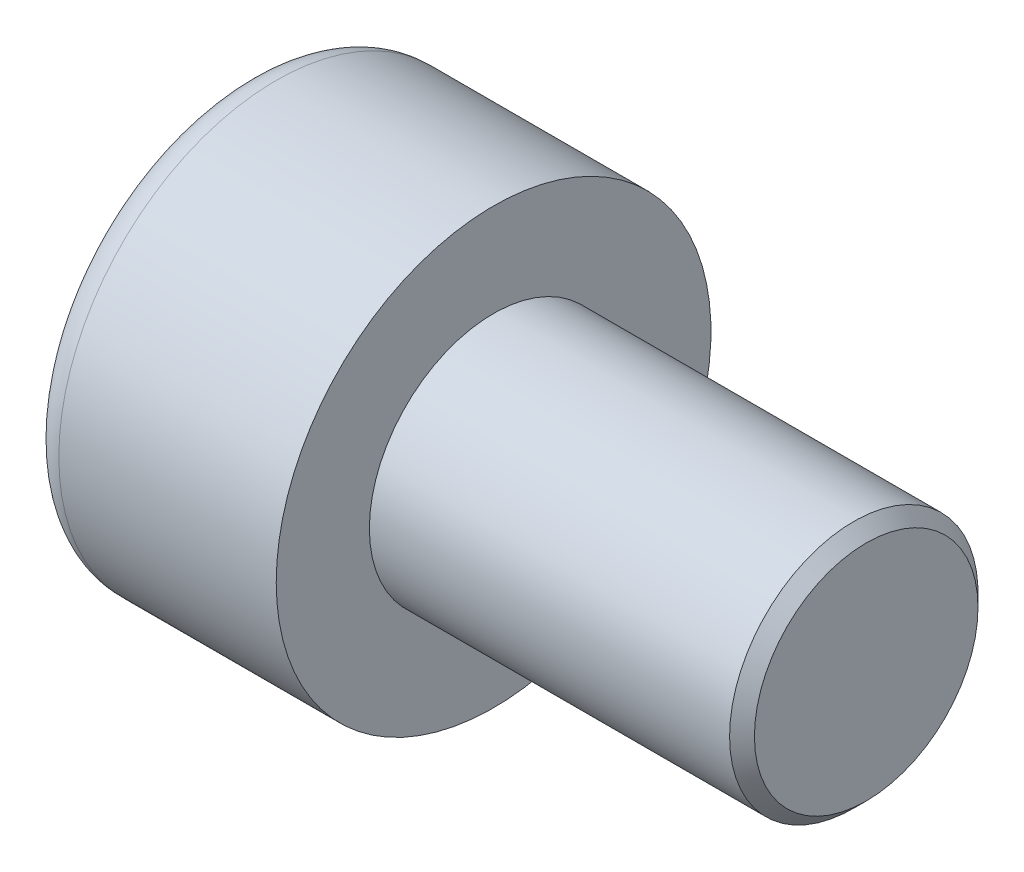
ISO-10303-21;
HEADER;
FILE_DESCRIPTION(('STEP AP214'),'2;1');
FILE_NAME('part.step','',(''),(''),'','','');
FILE_SCHEMA(('AUTOMOTIVE_DESIGN { 1 0 10303 214 1 1 1 1 }'));
ENDSEC;
DATA;
#1=APPLICATION_CONTEXT('core data for automotive mechanical design processes');
#2=APPLICATION_PROTOCOL_DEFINITION('international standard','automotive_design',2000,#1);
#3=PRODUCT_CONTEXT('',#1,'mechanical');
#4=PRODUCT('Part','Part','',(#3));
#5=PRODUCT_RELATED_PRODUCT_CATEGORY('part','',(#4));
#6=PRODUCT_DEFINITION_FORMATION('','',#4);
#7=PRODUCT_DEFINITION_CONTEXT('part definition',#1,'design');
#8=PRODUCT_DEFINITION('design','',#6,#7);
#9=PRODUCT_DEFINITION_SHAPE('','',#8);
#10=(LENGTH_UNIT() NAMED_UNIT(*) SI_UNIT(.MILLI.,.METRE.));
#11=(NAMED_UNIT(*) PLANE_ANGLE_UNIT() SI_UNIT($,.RADIAN.));
#12=(NAMED_UNIT(*) SI_UNIT($,.STERADIAN.) SOLID_ANGLE_UNIT());
#13=UNCERTAINTY_MEASURE_WITH_UNIT(LENGTH_MEASURE(1.E-05),#10,'distance_accuracy_value','');
#14=(GEOMETRIC_REPRESENTATION_CONTEXT(3) GLOBAL_UNCERTAINTY_ASSIGNED_CONTEXT((#13)) GLOBAL_UNIT_ASSIGNED_CONTEXT((#10,
#11,#12)) REPRESENTATION_CONTEXT('',''));
#15=CARTESIAN_POINT('',(0.,0.,0.));
#16=DIRECTION('',(0.,0.,1.));
#17=DIRECTION('',(1.,0.,0.));
#18=AXIS2_PLACEMENT_3D('',#15,#16,#17);
#19=CARTESIAN_POINT('',(2.,0.,-1.73205080756888));
#20=DIRECTION('',(1.,0.,0.));
#21=DIRECTION('',(0.,0.,-1.));
#22=AXIS2_PLACEMENT_3D('',#19,#20,#21);
#23=PLANE('',#22);
#24=DIRECTION('',(0.,0.866025403784439,0.5));
#25=VECTOR('',#24,1.);
#26=CARTESIAN_POINT('',(2.,0.,1.73205080756888));
#27=LINE('',#26,#25);
#28=CARTESIAN_POINT('',(2.,0.,1.73205080756888));
#29=VERTEX_POINT('',#28);
#30=CARTESIAN_POINT('',(2.00000000000477,-0.750000000005344,1.29903810568591));
#31=VERTEX_POINT('',#30);
#32=EDGE_CURVE('E120',#29,#31,#27,.F.);
#33=ORIENTED_EDGE('',*,*,#32,.F.);
#34=DIRECTION('',(0.,0.866025403784439,-0.5));
#35=VECTOR('',#34,1.);
#36=CARTESIAN_POINT('',(2.,1.5,0.866025403784439));
#37=LINE('',#36,#35);
#38=CARTESIAN_POINT('',(2.00000000000477,0.750000000005344,1.29903810568591));
#39=VERTEX_POINT('',#38);
#40=EDGE_CURVE('E119',#39,#29,#37,.F.);
#41=ORIENTED_EDGE('',*,*,#40,.F.);
#42=CARTESIAN_POINT('',(2.00000000000955,0.,0.));
#43=DIRECTION('',(-1.,0.,0.));
#44=DIRECTION('',(0.,0.,1.));
#45=AXIS2_PLACEMENT_3D('',#42,#43,#44);
#46=CIRCLE('',#45,1.50000000002137);
#47=EDGE_CURVE('E94',#39,#31,#46,.F.);
#48=ORIENTED_EDGE('',*,*,#47,.T.);
#49=EDGE_LOOP('',(#33,#41,#48));
#50=FACE_BOUND('',#49,.T.);
#51=ADVANCED_FACE('F16',(#50),#23,.F.);
#52=CARTESIAN_POINT('',(2.,0.,-1.73205080756888));
#53=DIRECTION('',(1.,0.,0.));
#54=DIRECTION('',(0.,0.,-1.));
#55=AXIS2_PLACEMENT_3D('',#52,#53,#54);
#56=PLANE('',#55);
#57=DIRECTION('',(0.,0.866025403784439,-0.5));
#58=VECTOR('',#57,1.);
#59=CARTESIAN_POINT('',(2.,1.5,0.866025403784439));
#60=LINE('',#59,#58);
#61=CARTESIAN_POINT('',(2.,1.5,0.866025403784439));
#62=VERTEX_POINT('',#61);
#63=EDGE_CURVE('E112',#62,#39,#60,.F.);
#64=ORIENTED_EDGE('',*,*,#63,.F.);
#65=DIRECTION('',(0.,0.,-1.));
#66=VECTOR('',#65,1.);
#67=CARTESIAN_POINT('',(2.,1.5,-0.866025403784438));
#68=LINE('',#67,#66);
#69=CARTESIAN_POINT('',(2.00000000000477,1.50000000001069,0.));
#70=VERTEX_POINT('',#69);
#71=EDGE_CURVE('E115',#70,#62,#68,.F.);
#72=ORIENTED_EDGE('',*,*,#71,.F.);
#73=CARTESIAN_POINT('',(2.00000000000955,0.,0.));
#74=DIRECTION('',(-1.,0.,0.));
#75=DIRECTION('',(0.,0.,1.));
#76=AXIS2_PLACEMENT_3D('',#73,#74,#75);
#77=CIRCLE('',#76,1.50000000002137);
#78=EDGE_CURVE('E98',#39,#70,#77,.T.);
#79=ORIENTED_EDGE('',*,*,#78,.F.);
#80=EDGE_LOOP('',(#64,#72,#79));
#81=FACE_BOUND('',#80,.T.);
#82=ADVANCED_FACE('F110',(#81),#56,.F.);
#83=CARTESIAN_POINT('',(2.,1.5,0.866025403784439));
#84=DIRECTION('',(0.,-0.5,-0.866025403784439));
#85=DIRECTION('',(0.,0.866025403784439,-0.5));
#86=AXIS2_PLACEMENT_3D('',#83,#84,#85);
#87=PLANE('',#86);
#88=ORIENTED_EDGE('',*,*,#40,.T.);
#89=DIRECTION('',(1.,0.,0.));
#90=VECTOR('',#89,1.);
#91=CARTESIAN_POINT('',(2.,0.,1.73205080756888));
#92=LINE('',#91,#90);
#93=CARTESIAN_POINT('',(0.,0.,1.73205080756888));
#94=VERTEX_POINT('',#93);
#95=EDGE_CURVE('E139',#94,#29,#92,.T.);
#96=ORIENTED_EDGE('',*,*,#95,.F.);
#97=DIRECTION('',(0.,0.866025403784439,-0.5));
#98=VECTOR('',#97,1.);
#99=CARTESIAN_POINT('',(0.,1.5,0.866025403784439));
#100=LINE('',#99,#98);
#101=CARTESIAN_POINT('',(0.,1.5,0.866025403784439));
#102=VERTEX_POINT('',#101);
#103=EDGE_CURVE('E117',#94,#102,#100,.T.);
#104=ORIENTED_EDGE('',*,*,#103,.T.);
#105=DIRECTION('',(1.,0.,0.));
#106=VECTOR('',#105,1.);
#107=CARTESIAN_POINT('',(2.,1.5,0.866025403784439));
#108=LINE('',#107,#106);
#109=EDGE_CURVE('E129',#62,#102,#108,.F.);
#110=ORIENTED_EDGE('',*,*,#109,.F.);
#111=ORIENTED_EDGE('',*,*,#63,.T.);
#112=EDGE_LOOP('',(#88,#96,#104,#110,#111));
#113=FACE_BOUND('',#112,.T.);
#114=ADVANCED_FACE('F126',(#113),#87,.T.);
#115=CARTESIAN_POINT('',(2.,0.,1.73205080756888));
#116=DIRECTION('',(0.,0.5,-0.866025403784439));
#117=DIRECTION('',(0.,0.866025403784439,0.5));
#118=AXIS2_PLACEMENT_3D('',#115,#116,#117);
#119=PLANE('',#118);
#120=DIRECTION('',(0.,-0.866025403784438,-0.500000000000001));
#121=VECTOR('',#120,1.);
#122=CARTESIAN_POINT('',(2.,-0.75,1.29903810567666));
#123=LINE('',#122,#121);
#124=CARTESIAN_POINT('',(2.,-1.5,0.866025403784438));
#125=VERTEX_POINT('',#124);
#126=EDGE_CURVE('E106',#31,#125,#123,.T.);
#127=ORIENTED_EDGE('',*,*,#126,.T.);
#128=DIRECTION('',(1.,0.,0.));
#129=VECTOR('',#128,1.);
#130=CARTESIAN_POINT('',(2.,-1.5,0.866025403784438));
#131=LINE('',#130,#129);
#132=CARTESIAN_POINT('',(0.,-1.5,0.866025403784438));
#133=VERTEX_POINT('',#132);
#134=EDGE_CURVE('E211',#133,#125,#131,.T.);
#135=ORIENTED_EDGE('',*,*,#134,.F.);
#136=DIRECTION('',(0.,0.866025403784439,0.5));
#137=VECTOR('',#136,1.);
#138=CARTESIAN_POINT('',(0.,0.,1.73205080756888));
#139=LINE('',#138,#137);
#140=EDGE_CURVE('E124',#133,#94,#139,.T.);
#141=ORIENTED_EDGE('',*,*,#140,.T.);
#142=ORIENTED_EDGE('',*,*,#95,.T.);
#143=ORIENTED_EDGE('',*,*,#32,.T.);
#144=EDGE_LOOP('',(#127,#135,#141,#142,#143));
#145=FACE_BOUND('',#144,.T.);
#146=ADVANCED_FACE('F342',(#145),#119,.T.);
#147=CARTESIAN_POINT('',(2.,0.,-1.73205080756888));
#148=DIRECTION('',(1.,0.,0.));
#149=DIRECTION('',(0.,0.,-1.));
#150=AXIS2_PLACEMENT_3D('',#147,#148,#149);
#151=PLANE('',#150);
#152=DIRECTION('',(0.,0.,1.));
#153=VECTOR('',#152,1.);
#154=CARTESIAN_POINT('',(2.,-1.5,0.866025403784438));
#155=LINE('',#154,#153);
#156=CARTESIAN_POINT('',(2.00000000000477,-1.50000000001069,0.));
#157=VERTEX_POINT('',#156);
#158=EDGE_CURVE('E208',#125,#157,#155,.F.);
#159=ORIENTED_EDGE('',*,*,#158,.F.);
#160=ORIENTED_EDGE('',*,*,#126,.F.);
#161=CARTESIAN_POINT('',(2.00000000000955,0.,0.));
#162=DIRECTION('',(-1.,0.,0.));
#163=DIRECTION('',(0.,0.,1.));
#164=AXIS2_PLACEMENT_3D('',#161,#162,#163);
#165=CIRCLE('',#164,1.50000000002137);
#166=EDGE_CURVE('E101',#31,#157,#165,.F.);
#167=ORIENTED_EDGE('',*,*,#166,.T.);
#168=EDGE_LOOP('',(#159,#160,#167));
#169=FACE_BOUND('',#168,.T.);
#170=ADVANCED_FACE('F338',(#169),#151,.F.);
#171=CARTESIAN_POINT('',(2.00000000000955,0.,0.));
#172=DIRECTION('',(-1.,0.,0.));
#173=DIRECTION('',(0.,0.,1.));
#174=AXIS2_PLACEMENT_3D('',#171,#172,#173);
#175=CONICAL_SURFACE('',#174,1.50000000002137,1.04719755120245);
#176=CARTESIAN_POINT('',(2.86602540381864,0.,0.));
#177=VERTEX_POINT('',#176);
#178=VERTEX_LOOP('',#177);
#179=FACE_BOUND('',#178,.T.);
#180=CARTESIAN_POINT('',(2.00000000000955,0.,0.));
#181=DIRECTION('',(-1.,0.,0.));
#182=DIRECTION('',(0.,0.,1.));
#183=AXIS2_PLACEMENT_3D('',#180,#181,#182);
#184=CIRCLE('',#183,1.50000000002137);
#185=CARTESIAN_POINT('',(2.00000000000477,0.750000000005344,-1.29903810568591));
#186=VERTEX_POINT('',#185);
#187=EDGE_CURVE('E153',#70,#186,#184,.T.);
#188=ORIENTED_EDGE('',*,*,#187,.T.);
#189=CARTESIAN_POINT('',(2.00000000000955,0.,0.));
#190=DIRECTION('',(-1.,0.,0.));
#191=DIRECTION('',(0.,0.,1.));
#192=AXIS2_PLACEMENT_3D('',#189,#190,#191);
#193=CIRCLE('',#192,1.50000000002137);
#194=CARTESIAN_POINT('',(2.00000000000477,-0.750000000005343,-1.29903810568591));
#195=VERTEX_POINT('',#194);
#196=EDGE_CURVE('E172',#195,#186,#193,.F.);
#197=ORIENTED_EDGE('',*,*,#196,.F.);
#198=CARTESIAN_POINT('',(2.00000000000955,0.,0.));
#199=DIRECTION('',(-1.,0.,0.));
#200=DIRECTION('',(0.,0.,1.));
#201=AXIS2_PLACEMENT_3D('',#198,#199,#200);
#202=CIRCLE('',#201,1.50000000002137);
#203=EDGE_CURVE('E167',#195,#157,#202,.T.);
#204=ORIENTED_EDGE('',*,*,#203,.T.);
#205=ORIENTED_EDGE('',*,*,#166,.F.);
#206=ORIENTED_EDGE('',*,*,#47,.F.);
#207=ORIENTED_EDGE('',*,*,#78,.T.);
#208=EDGE_LOOP('',(#188,#197,#204,#205,#206,#207));
#209=FACE_BOUND('',#208,.T.);
#210=ADVANCED_FACE('F97',(#179,#209),#175,.F.);
#211=CARTESIAN_POINT('',(2.,0.,-1.73205080756888));
#212=DIRECTION('',(1.,0.,0.));
#213=DIRECTION('',(0.,0.,-1.));
#214=AXIS2_PLACEMENT_3D('',#211,#212,#213);
#215=PLANE('',#214);
#216=DIRECTION('',(0.,0.,-1.));
#217=VECTOR('',#216,1.);
#218=CARTESIAN_POINT('',(2.,1.5,-0.866025403784438));
#219=LINE('',#218,#217);
#220=CARTESIAN_POINT('',(2.,1.5,-0.866025403784438));
#221=VERTEX_POINT('',#220);
#222=EDGE_CURVE('E152',#221,#70,#219,.F.);
#223=ORIENTED_EDGE('',*,*,#222,.F.);
#224=DIRECTION('',(0.,-0.866025403784438,-0.5));
#225=VECTOR('',#224,1.);
#226=CARTESIAN_POINT('',(2.,0.,-1.73205080756888));
#227=LINE('',#226,#225);
#228=EDGE_CURVE('E195',#186,#221,#227,.F.);
#229=ORIENTED_EDGE('',*,*,#228,.F.);
#230=ORIENTED_EDGE('',*,*,#187,.F.);
#231=EDGE_LOOP('',(#223,#229,#230));
#232=FACE_BOUND('',#231,.T.);
#233=ADVANCED_FACE('F332',(#232),#215,.F.);
#234=CARTESIAN_POINT('',(2.,1.5,-0.866025403784438));
#235=DIRECTION('',(0.,-1.,0.));
#236=DIRECTION('',(0.,0.,-1.));
#237=AXIS2_PLACEMENT_3D('',#234,#235,#236);
#238=PLANE('',#237);
#239=ORIENTED_EDGE('',*,*,#71,.T.);
#240=ORIENTED_EDGE('',*,*,#109,.T.);
#241=DIRECTION('',(0.,0.,-1.));
#242=VECTOR('',#241,1.);
#243=CARTESIAN_POINT('',(0.,1.5,-0.866025403784438));
#244=LINE('',#243,#242);
#245=CARTESIAN_POINT('',(0.,1.5,-0.866025403784438));
#246=VERTEX_POINT('',#245);
#247=EDGE_CURVE('E149',#102,#246,#244,.T.);
#248=ORIENTED_EDGE('',*,*,#247,.T.);
#249=DIRECTION('',(1.,0.,0.));
#250=VECTOR('',#249,1.);
#251=CARTESIAN_POINT('',(2.,1.5,-0.866025403784438));
#252=LINE('',#251,#250);
#253=EDGE_CURVE('E166',#221,#246,#252,.F.);
#254=ORIENTED_EDGE('',*,*,#253,.F.);
#255=ORIENTED_EDGE('',*,*,#222,.T.);
#256=EDGE_LOOP('',(#239,#240,#248,#254,#255));
#257=FACE_BOUND('',#256,.T.);
#258=ADVANCED_FACE('F328',(#257),#238,.T.);
#259=CARTESIAN_POINT('',(10.,0.,0.));
#260=DIRECTION('',(1.,0.,0.));
#261=DIRECTION('',(0.,0.,-1.));
#262=AXIS2_PLACEMENT_3D('',#259,#260,#261);
#263=PLANE('',#262);
#264=CARTESIAN_POINT('',(9.99999999993406,0.,0.));
#265=DIRECTION('',(-1.,0.,0.));
#266=DIRECTION('',(0.,0.,1.));
#267=AXIS2_PLACEMENT_3D('',#264,#265,#266);
#268=CIRCLE('',#267,1.80000000000291);
#269=CARTESIAN_POINT('',(9.99999999993406,0.,1.80000000000291));
#270=VERTEX_POINT('',#269);
#271=EDGE_CURVE('E162',#270,#270,#268,.T.);
#272=ORIENTED_EDGE('',*,*,#271,.F.);
#273=EDGE_LOOP('',(#272));
#274=FACE_BOUND('',#273,.T.);
#275=ADVANCED_FACE('F325',(#274),#263,.T.);
#276=CARTESIAN_POINT('',(2.,-1.5,0.866025403784438));
#277=DIRECTION('',(0.,1.,0.));
#278=DIRECTION('',(0.,0.,1.));
#279=AXIS2_PLACEMENT_3D('',#276,#277,#278);
#280=PLANE('',#279);
#281=DIRECTION('',(0.,0.,-1.));
#282=VECTOR('',#281,1.);
#283=CARTESIAN_POINT('',(2.,-1.5,-1.73205080756888));
#284=LINE('',#283,#282);
#285=CARTESIAN_POINT('',(2.,-1.5,-0.866025403784439));
#286=VERTEX_POINT('',#285);
#287=EDGE_CURVE('E170',#157,#286,#284,.T.);
#288=ORIENTED_EDGE('',*,*,#287,.T.);
#289=DIRECTION('',(1.,0.,0.));
#290=VECTOR('',#289,1.);
#291=CARTESIAN_POINT('',(2.,-1.5,-0.866025403784439));
#292=LINE('',#291,#290);
#293=CARTESIAN_POINT('',(0.,-1.5,-0.866025403784439));
#294=VERTEX_POINT('',#293);
#295=EDGE_CURVE('E165',#294,#286,#292,.T.);
#296=ORIENTED_EDGE('',*,*,#295,.F.);
#297=DIRECTION('',(0.,0.,1.));
#298=VECTOR('',#297,1.);
#299=CARTESIAN_POINT('',(0.,-1.5,0.866025403784438));
#300=LINE('',#299,#298);
#301=EDGE_CURVE('E219',#294,#133,#300,.T.);
#302=ORIENTED_EDGE('',*,*,#301,.T.);
#303=ORIENTED_EDGE('',*,*,#134,.T.);
#304=ORIENTED_EDGE('',*,*,#158,.T.);
#305=EDGE_LOOP('',(#288,#296,#302,#303,#304));
#306=FACE_BOUND('',#305,.T.);
#307=ADVANCED_FACE('F321',(#306),#280,.T.);
#308=CARTESIAN_POINT('',(2.,0.,-1.73205080756888));
#309=DIRECTION('',(1.,0.,0.));
#310=DIRECTION('',(0.,0.,-1.));
#311=AXIS2_PLACEMENT_3D('',#308,#309,#310);
#312=PLANE('',#311);
#313=DIRECTION('',(0.,-0.866025403784439,0.5));
#314=VECTOR('',#313,1.);
#315=CARTESIAN_POINT('',(2.,-1.5,-0.866025403784439));
#316=LINE('',#315,#314);
#317=EDGE_CURVE('E236',#286,#195,#316,.F.);
#318=ORIENTED_EDGE('',*,*,#317,.F.);
#319=ORIENTED_EDGE('',*,*,#287,.F.);
#320=ORIENTED_EDGE('',*,*,#203,.F.);
#321=EDGE_LOOP('',(#318,#319,#320));
#322=FACE_BOUND('',#321,.T.);
#323=ADVANCED_FACE('F317',(#322),#312,.F.);
#324=CARTESIAN_POINT('',(2.,0.,-1.73205080756888));
#325=DIRECTION('',(1.,0.,0.));
#326=DIRECTION('',(0.,0.,-1.));
#327=AXIS2_PLACEMENT_3D('',#324,#325,#326);
#328=PLANE('',#327);
#329=DIRECTION('',(0.,-0.866025403784438,-0.5));
#330=VECTOR('',#329,1.);
#331=CARTESIAN_POINT('',(2.,0.,-1.73205080756888));
#332=LINE('',#331,#330);
#333=CARTESIAN_POINT('',(2.,0.,-1.73205080756888));
#334=VERTEX_POINT('',#333);
#335=EDGE_CURVE('E198',#334,#186,#332,.F.);
#336=ORIENTED_EDGE('',*,*,#335,.F.);
#337=DIRECTION('',(0.,-0.866025403784439,0.5));
#338=VECTOR('',#337,1.);
#339=CARTESIAN_POINT('',(2.,-1.5,-0.866025403784439));
#340=LINE('',#339,#338);
#341=EDGE_CURVE('E247',#195,#334,#340,.F.);
#342=ORIENTED_EDGE('',*,*,#341,.F.);
#343=ORIENTED_EDGE('',*,*,#196,.T.);
#344=EDGE_LOOP('',(#336,#342,#343));
#345=FACE_BOUND('',#344,.T.);
#346=ADVANCED_FACE('F313',(#345),#328,.F.);
#347=CARTESIAN_POINT('',(2.,0.,-1.73205080756888));
#348=DIRECTION('',(0.,-0.5,0.866025403784438));
#349=DIRECTION('',(0.,-0.866025403784438,-0.5));
#350=AXIS2_PLACEMENT_3D('',#347,#348,#349);
#351=PLANE('',#350);
#352=ORIENTED_EDGE('',*,*,#228,.T.);
#353=ORIENTED_EDGE('',*,*,#253,.T.);
#354=DIRECTION('',(0.,-0.866025403784438,-0.5));
#355=VECTOR('',#354,1.);
#356=CARTESIAN_POINT('',(0.,0.,-1.73205080756888));
#357=LINE('',#356,#355);
#358=CARTESIAN_POINT('',(0.,0.,-1.73205080756888));
#359=VERTEX_POINT('',#358);
#360=EDGE_CURVE('E169',#246,#359,#357,.T.);
#361=ORIENTED_EDGE('',*,*,#360,.T.);
#362=DIRECTION('',(1.,0.,0.));
#363=VECTOR('',#362,1.);
#364=CARTESIAN_POINT('',(2.,0.,-1.73205080756888));
#365=LINE('',#364,#363);
#366=EDGE_CURVE('E187',#334,#359,#365,.F.);
#367=ORIENTED_EDGE('',*,*,#366,.F.);
#368=ORIENTED_EDGE('',*,*,#335,.T.);
#369=EDGE_LOOP('',(#352,#353,#361,#367,#368));
#370=FACE_BOUND('',#369,.T.);
#371=ADVANCED_FACE('F309',(#370),#351,.T.);
#372=CARTESIAN_POINT('',(9.79999999998427,0.,0.));
#373=DIRECTION('',(-1.,0.,0.));
#374=DIRECTION('',(0.,0.,1.));
#375=AXIS2_PLACEMENT_3D('',#372,#373,#374);
#376=CONICAL_SURFACE('',#375,1.99999999995271,0.785398163397448);
#377=CARTESIAN_POINT('',(9.8,0.,0.));
#378=DIRECTION('',(-1.,0.,0.));
#379=DIRECTION('',(0.,0.,1.));
#380=AXIS2_PLACEMENT_3D('',#377,#378,#379);
#381=CIRCLE('',#380,2.);
#382=CARTESIAN_POINT('',(9.8,0.,2.));
#383=VERTEX_POINT('',#382);
#384=EDGE_CURVE('E180',#383,#383,#381,.T.);
#385=ORIENTED_EDGE('',*,*,#384,.F.);
#386=EDGE_LOOP('',(#385));
#387=FACE_BOUND('',#386,.T.);
#388=ORIENTED_EDGE('',*,*,#271,.T.);
#389=EDGE_LOOP('',(#388));
#390=FACE_BOUND('',#389,.T.);
#391=ADVANCED_FACE('F306',(#387,#390),#376,.T.);
#392=CARTESIAN_POINT('',(2.,-1.5,-0.866025403784439));
#393=DIRECTION('',(0.,0.5,0.866025403784439));
#394=DIRECTION('',(0.,-0.866025403784439,0.5));
#395=AXIS2_PLACEMENT_3D('',#392,#393,#394);
#396=PLANE('',#395);
#397=ORIENTED_EDGE('',*,*,#341,.T.);
#398=ORIENTED_EDGE('',*,*,#366,.T.);
#399=DIRECTION('',(0.,-0.866025403784439,0.5));
#400=VECTOR('',#399,1.);
#401=CARTESIAN_POINT('',(0.,0.,-1.73205080756888));
#402=LINE('',#401,#400);
#403=EDGE_CURVE('E178',#359,#294,#402,.T.);
#404=ORIENTED_EDGE('',*,*,#403,.T.);
#405=ORIENTED_EDGE('',*,*,#295,.T.);
#406=ORIENTED_EDGE('',*,*,#317,.T.);
#407=EDGE_LOOP('',(#397,#398,#404,#405,#406));
#408=FACE_BOUND('',#407,.T.);
#409=ADVANCED_FACE('F302',(#408),#396,.T.);
#410=CARTESIAN_POINT('',(10.,0.,0.));
#411=DIRECTION('',(-1.,0.,0.));
#412=DIRECTION('',(0.,0.,1.));
#413=AXIS2_PLACEMENT_3D('',#410,#411,#412);
#414=CYLINDRICAL_SURFACE('',#413,2.);
#415=CARTESIAN_POINT('',(4.,0.,0.));
#416=DIRECTION('',(-1.,0.,0.));
#417=DIRECTION('',(0.,0.,1.));
#418=AXIS2_PLACEMENT_3D('',#415,#416,#417);
#419=CIRCLE('',#418,2.);
#420=CARTESIAN_POINT('',(4.,0.,2.));
#421=VERTEX_POINT('',#420);
#422=EDGE_CURVE('E159',#421,#421,#419,.T.);
#423=ORIENTED_EDGE('',*,*,#422,.F.);
#424=EDGE_LOOP('',(#423));
#425=FACE_BOUND('',#424,.T.);
#426=ORIENTED_EDGE('',*,*,#384,.T.);
#427=EDGE_LOOP('',(#426));
#428=FACE_BOUND('',#427,.T.);
#429=ADVANCED_FACE('F290',(#425,#428),#414,.T.);
#430=CARTESIAN_POINT('',(0.,0.,0.));
#431=DIRECTION('',(1.,0.,0.));
#432=DIRECTION('',(0.,0.,-1.));
#433=AXIS2_PLACEMENT_3D('',#430,#431,#432);
#434=PLANE('',#433);
#435=ORIENTED_EDGE('',*,*,#360,.F.);
#436=ORIENTED_EDGE('',*,*,#247,.F.);
#437=ORIENTED_EDGE('',*,*,#103,.F.);
#438=ORIENTED_EDGE('',*,*,#140,.F.);
#439=ORIENTED_EDGE('',*,*,#301,.F.);
#440=ORIENTED_EDGE('',*,*,#403,.F.);
#441=EDGE_LOOP('',(#435,#436,#437,#438,#439,#440));
#442=FACE_BOUND('',#441,.T.);
#443=CARTESIAN_POINT('',(0.,0.,0.));
#444=DIRECTION('',(1.,0.,0.));
#445=DIRECTION('',(0.,0.,-1.));
#446=AXIS2_PLACEMENT_3D('',#443,#444,#445);
#447=CIRCLE('',#446,3.);
#448=CARTESIAN_POINT('',(0.,0.,-3.));
#449=VERTEX_POINT('',#448);
#450=CARTESIAN_POINT('',(0.,0.,3.));
#451=VERTEX_POINT('',#450);
#452=EDGE_CURVE('E158',#449,#451,#447,.T.);
#453=ORIENTED_EDGE('',*,*,#452,.F.);
#454=CARTESIAN_POINT('',(0.,0.,0.));
#455=DIRECTION('',(1.,0.,0.));
#456=DIRECTION('',(0.,0.,1.));
#457=AXIS2_PLACEMENT_3D('',#454,#455,#456);
#458=CIRCLE('',#457,3.);
#459=EDGE_CURVE('E35',#451,#449,#458,.T.);
#460=ORIENTED_EDGE('',*,*,#459,.F.);
#461=EDGE_LOOP('',(#453,#460));
#462=FACE_BOUND('',#461,.T.);
#463=ADVANCED_FACE('F281',(#442,#462),#434,.F.);
#464=CARTESIAN_POINT('',(4.,0.,0.));
#465=DIRECTION('',(1.,0.,0.));
#466=DIRECTION('',(0.,0.,-1.));
#467=AXIS2_PLACEMENT_3D('',#464,#465,#466);
#468=PLANE('',#467);
#469=CARTESIAN_POINT('',(4.,0.,0.));
#470=DIRECTION('',(-1.,0.,0.));
#471=DIRECTION('',(0.,0.,1.));
#472=AXIS2_PLACEMENT_3D('',#469,#470,#471);
#473=CIRCLE('',#472,3.5);
#474=CARTESIAN_POINT('',(4.,0.,3.5));
#475=VERTEX_POINT('',#474);
#476=EDGE_CURVE('E27',#475,#475,#473,.T.);
#477=ORIENTED_EDGE('',*,*,#476,.F.);
#478=EDGE_LOOP('',(#477));
#479=FACE_BOUND('',#478,.T.);
#480=ORIENTED_EDGE('',*,*,#422,.T.);
#481=EDGE_LOOP('',(#480));
#482=FACE_BOUND('',#481,.T.);
#483=ADVANCED_FACE('F272',(#479,#482),#468,.T.);
#484=CARTESIAN_POINT('',(0.5,0.,0.));
#485=DIRECTION('',(1.,0.,0.));
#486=DIRECTION('',(0.,0.,-1.));
#487=AXIS2_PLACEMENT_3D('',#484,#485,#486);
#488=TOROIDAL_SURFACE('',#487,3.,0.5);
#489=CARTESIAN_POINT('',(0.5,0.,0.));
#490=DIRECTION('',(-1.,0.,0.));
#491=DIRECTION('',(0.,0.,1.));
#492=AXIS2_PLACEMENT_3D('',#489,#490,#491);
#493=CIRCLE('',#492,3.5);
#494=CARTESIAN_POINT('',(0.5,0.,3.5));
#495=VERTEX_POINT('',#494);
#496=EDGE_CURVE('E11',#495,#495,#493,.F.);
#497=ORIENTED_EDGE('',*,*,#496,.F.);
#498=EDGE_LOOP('',(#497));
#499=FACE_BOUND('',#498,.T.);
#500=ORIENTED_EDGE('',*,*,#452,.T.);
#501=ORIENTED_EDGE('',*,*,#459,.T.);
#502=EDGE_LOOP('',(#500,#501));
#503=FACE_BOUND('',#502,.T.);
#504=ADVANCED_FACE('F176',(#499,#503),#488,.T.);
#505=CARTESIAN_POINT('',(4.,0.,0.));
#506=DIRECTION('',(-1.,0.,0.));
#507=DIRECTION('',(0.,0.,1.));
#508=AXIS2_PLACEMENT_3D('',#505,#506,#507);
#509=CYLINDRICAL_SURFACE('',#508,3.5);
#510=ORIENTED_EDGE('',*,*,#496,.T.);
#511=EDGE_LOOP('',(#510));
#512=FACE_BOUND('',#511,.T.);
#513=ORIENTED_EDGE('',*,*,#476,.T.);
#514=EDGE_LOOP('',(#513));
#515=FACE_BOUND('',#514,.T.);
#516=ADVANCED_FACE('F271',(#512,#515),#509,.T.);
#517=CLOSED_SHELL('',(#51,#82,#114,#146,#170,#210,#233,#258,#275,#307,#323,#346,#371,#391,#409,
#429,#463,#483,#504,#516));
#518=MANIFOLD_SOLID_BREP('B1',#517);
#519=ADVANCED_BREP_SHAPE_REPRESENTATION('',(#18,#518),#14);
#520=SHAPE_DEFINITION_REPRESENTATION(#9,#519);
ENDSEC;
END-ISO-10303-21;
